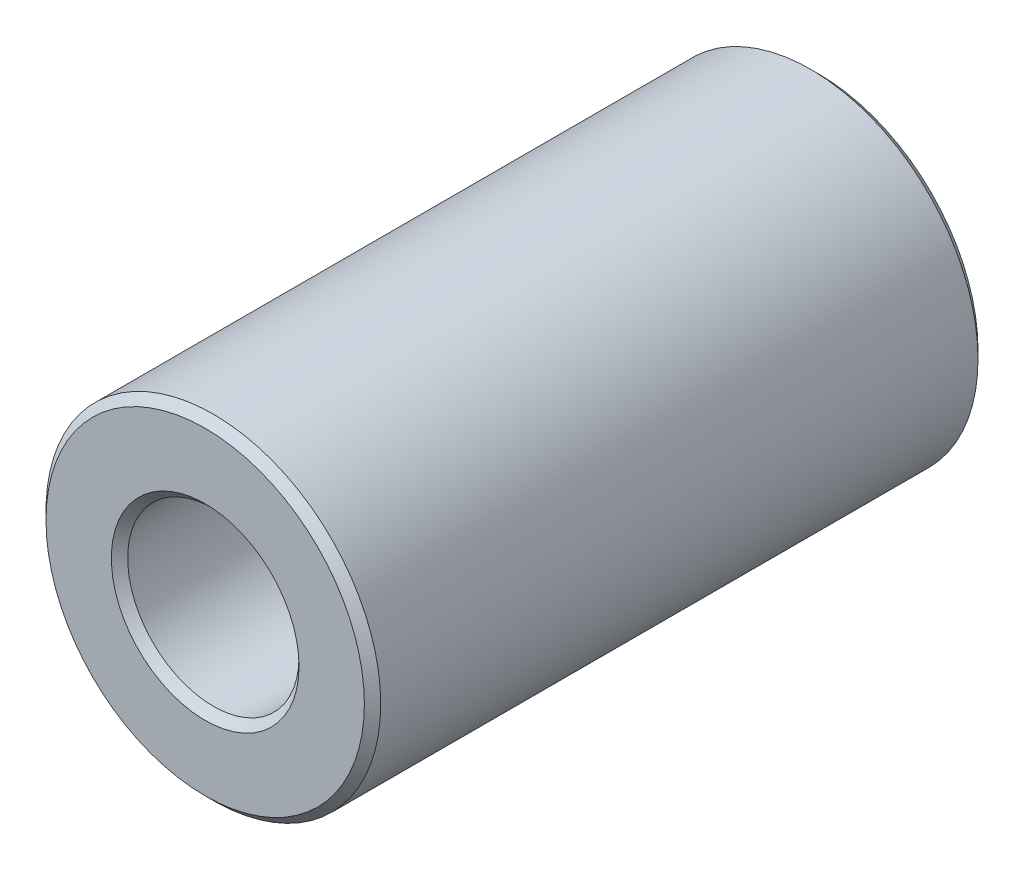
ISO-10303-21;
HEADER;
FILE_DESCRIPTION(('STEP AP214'),'2;1');
FILE_NAME('part.step','',(''),(''),'','','');
FILE_SCHEMA(('AUTOMOTIVE_DESIGN { 1 0 10303 214 1 1 1 1 }'));
ENDSEC;
DATA;
#1=APPLICATION_CONTEXT('core data for automotive mechanical design processes');
#2=APPLICATION_PROTOCOL_DEFINITION('international standard','automotive_design',2000,#1);
#3=PRODUCT_CONTEXT('',#1,'mechanical');
#4=PRODUCT('Part','Part','',(#3));
#5=PRODUCT_RELATED_PRODUCT_CATEGORY('part','',(#4));
#6=PRODUCT_DEFINITION_FORMATION('','',#4);
#7=PRODUCT_DEFINITION_CONTEXT('part definition',#1,'design');
#8=PRODUCT_DEFINITION('design','',#6,#7);
#9=PRODUCT_DEFINITION_SHAPE('','',#8);
#10=(LENGTH_UNIT() NAMED_UNIT(*) SI_UNIT(.MILLI.,.METRE.));
#11=(NAMED_UNIT(*) PLANE_ANGLE_UNIT() SI_UNIT($,.RADIAN.));
#12=(NAMED_UNIT(*) SI_UNIT($,.STERADIAN.) SOLID_ANGLE_UNIT());
#13=UNCERTAINTY_MEASURE_WITH_UNIT(LENGTH_MEASURE(1.E-05),#10,'distance_accuracy_value','');
#14=(GEOMETRIC_REPRESENTATION_CONTEXT(3) GLOBAL_UNCERTAINTY_ASSIGNED_CONTEXT((#13)) GLOBAL_UNIT_ASSIGNED_CONTEXT((#10,
#11,#12)) REPRESENTATION_CONTEXT('',''));
#15=CARTESIAN_POINT('',(0.,0.,0.));
#16=DIRECTION('',(0.,0.,1.));
#17=DIRECTION('',(1.,0.,0.));
#18=AXIS2_PLACEMENT_3D('',#15,#16,#17);
#19=CARTESIAN_POINT('',(0.,0.,-8.73125));
#20=DIRECTION('',(0.,0.,1.));
#21=DIRECTION('',(1.,0.,0.));
#22=AXIS2_PLACEMENT_3D('',#19,#20,#21);
#23=CYLINDRICAL_SURFACE('',#22,4.7625);
#24=CARTESIAN_POINT('',(0.,0.,8.49884));
#25=DIRECTION('',(0.,0.,1.));
#26=DIRECTION('',(1.,0.,0.));
#27=AXIS2_PLACEMENT_3D('',#24,#25,#26);
#28=CIRCLE('',#27,4.7625);
#29=CARTESIAN_POINT('',(4.7625,0.,8.49884));
#30=VERTEX_POINT('',#29);
#31=EDGE_CURVE('E55',#30,#30,#28,.F.);
#32=ORIENTED_EDGE('',*,*,#31,.T.);
#33=EDGE_LOOP('',(#32));
#34=FACE_BOUND('',#33,.T.);
#35=CARTESIAN_POINT('',(0.,0.,-8.49884));
#36=DIRECTION('',(0.,0.,1.));
#37=DIRECTION('',(1.,0.,0.));
#38=AXIS2_PLACEMENT_3D('',#35,#36,#37);
#39=CIRCLE('',#38,4.7625);
#40=CARTESIAN_POINT('',(4.7625,0.,-8.49884));
#41=VERTEX_POINT('',#40);
#42=EDGE_CURVE('E58',#41,#41,#39,.T.);
#43=ORIENTED_EDGE('',*,*,#42,.T.);
#44=EDGE_LOOP('',(#43));
#45=FACE_BOUND('',#44,.T.);
#46=ADVANCED_FACE('F35',(#34,#45),#23,.T.);
#47=CARTESIAN_POINT('',(0.,0.,-8.73125));
#48=DIRECTION('',(0.,0.,1.));
#49=DIRECTION('',(1.,0.,0.));
#50=AXIS2_PLACEMENT_3D('',#47,#48,#49);
#51=PLANE('',#50);
#52=CARTESIAN_POINT('',(0.,0.,-8.73125));
#53=DIRECTION('',(0.,0.,1.));
#54=DIRECTION('',(1.,0.,0.));
#55=AXIS2_PLACEMENT_3D('',#52,#53,#54);
#56=CIRCLE('',#55,4.53009);
#57=CARTESIAN_POINT('',(4.53009,0.,-8.73125));
#58=VERTEX_POINT('',#57);
#59=EDGE_CURVE('E46',#58,#58,#56,.F.);
#60=ORIENTED_EDGE('',*,*,#59,.T.);
#61=EDGE_LOOP('',(#60));
#62=FACE_BOUND('',#61,.T.);
#63=CARTESIAN_POINT('',(0.,0.,-8.73125));
#64=DIRECTION('',(0.,0.,1.));
#65=DIRECTION('',(1.,0.,0.));
#66=AXIS2_PLACEMENT_3D('',#63,#64,#65);
#67=CIRCLE('',#66,2.67081000000001);
#68=CARTESIAN_POINT('',(-2.67081000000001,0.,-8.73125));
#69=VERTEX_POINT('',#68);
#70=EDGE_CURVE('E50',#69,#69,#67,.T.);
#71=ORIENTED_EDGE('',*,*,#70,.T.);
#72=EDGE_LOOP('',(#71));
#73=FACE_BOUND('',#72,.T.);
#74=ADVANCED_FACE('F83',(#62,#73),#51,.F.);
#75=CARTESIAN_POINT('',(0.,0.,-8.73125));
#76=DIRECTION('',(0.,0.,1.));
#77=DIRECTION('',(1.,0.,0.));
#78=AXIS2_PLACEMENT_3D('',#75,#76,#77);
#79=CYLINDRICAL_SURFACE('',#78,2.4384);
#80=CARTESIAN_POINT('',(0.,0.,8.49884));
#81=DIRECTION('',(0.,0.,1.));
#82=DIRECTION('',(1.,0.,0.));
#83=AXIS2_PLACEMENT_3D('',#80,#81,#82);
#84=CIRCLE('',#83,2.4384);
#85=CARTESIAN_POINT('',(2.4384,0.,8.49884));
#86=VERTEX_POINT('',#85);
#87=EDGE_CURVE('E10',#86,#86,#84,.T.);
#88=ORIENTED_EDGE('',*,*,#87,.T.);
#89=EDGE_LOOP('',(#88));
#90=FACE_BOUND('',#89,.T.);
#91=CARTESIAN_POINT('',(0.,0.,-8.49884));
#92=DIRECTION('',(0.,0.,1.));
#93=DIRECTION('',(1.,0.,0.));
#94=AXIS2_PLACEMENT_3D('',#91,#92,#93);
#95=CIRCLE('',#94,2.4384);
#96=CARTESIAN_POINT('',(-2.4384,0.,-8.49884));
#97=VERTEX_POINT('',#96);
#98=EDGE_CURVE('E42',#97,#97,#95,.F.);
#99=ORIENTED_EDGE('',*,*,#98,.T.);
#100=EDGE_LOOP('',(#99));
#101=FACE_BOUND('',#100,.T.);
#102=ADVANCED_FACE('F89',(#90,#101),#79,.F.);
#103=CARTESIAN_POINT('',(0.,0.,8.73125));
#104=DIRECTION('',(0.,0.,1.));
#105=DIRECTION('',(1.,0.,0.));
#106=AXIS2_PLACEMENT_3D('',#103,#104,#105);
#107=PLANE('',#106);
#108=CARTESIAN_POINT('',(0.,0.,8.73125));
#109=DIRECTION('',(0.,0.,1.));
#110=DIRECTION('',(1.,0.,0.));
#111=AXIS2_PLACEMENT_3D('',#108,#109,#110);
#112=CIRCLE('',#111,4.53009);
#113=CARTESIAN_POINT('',(4.53009,0.,8.73125));
#114=VERTEX_POINT('',#113);
#115=EDGE_CURVE('E61',#114,#114,#112,.T.);
#116=ORIENTED_EDGE('',*,*,#115,.T.);
#117=EDGE_LOOP('',(#116));
#118=FACE_BOUND('',#117,.T.);
#119=CARTESIAN_POINT('',(0.,0.,8.73125));
#120=DIRECTION('',(0.,0.,1.));
#121=DIRECTION('',(1.,0.,0.));
#122=AXIS2_PLACEMENT_3D('',#119,#120,#121);
#123=CIRCLE('',#122,2.67081);
#124=CARTESIAN_POINT('',(2.67081,0.,8.73125));
#125=VERTEX_POINT('',#124);
#126=EDGE_CURVE('E64',#125,#125,#123,.F.);
#127=ORIENTED_EDGE('',*,*,#126,.T.);
#128=EDGE_LOOP('',(#127));
#129=FACE_BOUND('',#128,.T.);
#130=ADVANCED_FACE('F68',(#118,#129),#107,.T.);
#131=CARTESIAN_POINT('',(0.,0.,8.73125));
#132=DIRECTION('',(0.,0.,-1.));
#133=DIRECTION('',(-1.,0.,0.));
#134=AXIS2_PLACEMENT_3D('',#131,#132,#133);
#135=CONICAL_SURFACE('',#134,4.53009,0.78539816339745);
#136=ORIENTED_EDGE('',*,*,#31,.F.);
#137=EDGE_LOOP('',(#136));
#138=FACE_BOUND('',#137,.T.);
#139=ORIENTED_EDGE('',*,*,#115,.F.);
#140=EDGE_LOOP('',(#139));
#141=FACE_BOUND('',#140,.T.);
#142=ADVANCED_FACE('F79',(#138,#141),#135,.T.);
#143=CARTESIAN_POINT('',(0.,0.,-8.49884));
#144=DIRECTION('',(0.,0.,1.));
#145=DIRECTION('',(1.,0.,0.));
#146=AXIS2_PLACEMENT_3D('',#143,#144,#145);
#147=CONICAL_SURFACE('',#146,4.7625,0.785398163397446);
#148=ORIENTED_EDGE('',*,*,#59,.F.);
#149=EDGE_LOOP('',(#148));
#150=FACE_BOUND('',#149,.T.);
#151=ORIENTED_EDGE('',*,*,#42,.F.);
#152=EDGE_LOOP('',(#151));
#153=FACE_BOUND('',#152,.T.);
#154=ADVANCED_FACE('F73',(#150,#153),#147,.T.);
#155=CARTESIAN_POINT('',(0.,0.,8.49884));
#156=DIRECTION('',(0.,0.,1.));
#157=DIRECTION('',(1.,0.,0.));
#158=AXIS2_PLACEMENT_3D('',#155,#156,#157);
#159=CONICAL_SURFACE('',#158,2.4384,0.785398163397441);
#160=ORIENTED_EDGE('',*,*,#126,.F.);
#161=EDGE_LOOP('',(#160));
#162=FACE_BOUND('',#161,.T.);
#163=ORIENTED_EDGE('',*,*,#87,.F.);
#164=EDGE_LOOP('',(#163));
#165=FACE_BOUND('',#164,.T.);
#166=ADVANCED_FACE('F70',(#162,#165),#159,.F.);
#167=CARTESIAN_POINT('',(0.,0.,-8.73125));
#168=DIRECTION('',(0.,0.,-1.));
#169=DIRECTION('',(-1.,0.,0.));
#170=AXIS2_PLACEMENT_3D('',#167,#168,#169);
#171=CONICAL_SURFACE('',#170,2.67081000000001,0.785398163397452);
#172=CARTESIAN_POINT('',(-2.4384,0.,-8.49884));
#173=CARTESIAN_POINT('',(-2.4408209375,0.,-8.5012609375));
#174=CARTESIAN_POINT('',(-2.443241875,0.,-8.50368187499999));
#175=CARTESIAN_POINT('',(-2.44808375,0.,-8.50852375));
#176=CARTESIAN_POINT('',(-2.4505046875,0.,-8.51094468749999));
#177=CARTESIAN_POINT('',(-2.4553465625,0.,-8.5157865625));
#178=CARTESIAN_POINT('',(-2.4577675,0.,-8.5182075));
#179=CARTESIAN_POINT('',(-2.462609375,0.,-8.523049375));
#180=CARTESIAN_POINT('',(-2.4650303125,0.,-8.5254703125));
#181=CARTESIAN_POINT('',(-2.4698721875,0.,-8.5303121875));
#182=CARTESIAN_POINT('',(-2.472293125,0.,-8.532733125));
#183=CARTESIAN_POINT('',(-2.477135,0.,-8.537575));
#184=CARTESIAN_POINT('',(-2.4795559375,0.,-8.5399959375));
#185=CARTESIAN_POINT('',(-2.4843978125,0.,-8.5448378125));
#186=CARTESIAN_POINT('',(-2.48681875,0.,-8.54725875));
#187=CARTESIAN_POINT('',(-2.491660625,0.,-8.552100625));
#188=CARTESIAN_POINT('',(-2.4940815625,0.,-8.5545215625));
#189=CARTESIAN_POINT('',(-2.4989234375,0.,-8.5593634375));
#190=CARTESIAN_POINT('',(-2.501344375,0.,-8.561784375));
#191=CARTESIAN_POINT('',(-2.50618625,0.,-8.56662625));
#192=CARTESIAN_POINT('',(-2.5086071875,0.,-8.5690471875));
#193=CARTESIAN_POINT('',(-2.5134490625,0.,-8.5738890625));
#194=CARTESIAN_POINT('',(-2.51587,0.,-8.57631));
#195=CARTESIAN_POINT('',(-2.520711875,0.,-8.581151875));
#196=CARTESIAN_POINT('',(-2.5231328125,0.,-8.5835728125));
#197=CARTESIAN_POINT('',(-2.5279746875,0.,-8.5884146875));
#198=CARTESIAN_POINT('',(-2.530395625,0.,-8.590835625));
#199=CARTESIAN_POINT('',(-2.5352375,0.,-8.5956775));
#200=CARTESIAN_POINT('',(-2.5376584375,0.,-8.5980984375));
#201=CARTESIAN_POINT('',(-2.5425003125,0.,-8.6029403125));
#202=CARTESIAN_POINT('',(-2.54492125,0.,-8.60536125));
#203=CARTESIAN_POINT('',(-2.549763125,0.,-8.610203125));
#204=CARTESIAN_POINT('',(-2.5521840625,0.,-8.6126240625));
#205=CARTESIAN_POINT('',(-2.5570259375,0.,-8.6174659375));
#206=CARTESIAN_POINT('',(-2.559446875,0.,-8.619886875));
#207=CARTESIAN_POINT('',(-2.56428875,0.,-8.62472875));
#208=CARTESIAN_POINT('',(-2.5667096875,0.,-8.6271496875));
#209=CARTESIAN_POINT('',(-2.5715515625,0.,-8.6319915625));
#210=CARTESIAN_POINT('',(-2.5739725,0.,-8.6344125));
#211=CARTESIAN_POINT('',(-2.57881437500001,0.,-8.639254375));
#212=CARTESIAN_POINT('',(-2.5812353125,0.,-8.6416753125));
#213=CARTESIAN_POINT('',(-2.5860771875,0.,-8.6465171875));
#214=CARTESIAN_POINT('',(-2.588498125,0.,-8.648938125));
#215=CARTESIAN_POINT('',(-2.59334,0.,-8.65378));
#216=CARTESIAN_POINT('',(-2.5957609375,0.,-8.6562009375));
#217=CARTESIAN_POINT('',(-2.6006028125,0.,-8.6610428125));
#218=CARTESIAN_POINT('',(-2.60302375000001,0.,-8.66346375));
#219=CARTESIAN_POINT('',(-2.60786562500001,0.,-8.668305625));
#220=CARTESIAN_POINT('',(-2.61028656250001,0.,-8.6707265625));
#221=CARTESIAN_POINT('',(-2.61512843750001,0.,-8.6755684375));
#222=CARTESIAN_POINT('',(-2.61754937500001,0.,-8.677989375));
#223=CARTESIAN_POINT('',(-2.62239125000001,0.,-8.68283125));
#224=CARTESIAN_POINT('',(-2.62481218750001,0.,-8.6852521875));
#225=CARTESIAN_POINT('',(-2.62965406250001,0.,-8.6900940625));
#226=CARTESIAN_POINT('',(-2.63207500000001,0.,-8.692515));
#227=CARTESIAN_POINT('',(-2.63691687500001,0.,-8.697356875));
#228=CARTESIAN_POINT('',(-2.63933781250001,0.,-8.6997778125));
#229=CARTESIAN_POINT('',(-2.64417968750001,0.,-8.7046196875));
#230=CARTESIAN_POINT('',(-2.64660062500001,0.,-8.707040625));
#231=CARTESIAN_POINT('',(-2.65144250000001,0.,-8.7118825));
#232=CARTESIAN_POINT('',(-2.65386343750001,0.,-8.7143034375));
#233=CARTESIAN_POINT('',(-2.65870531250001,0.,-8.7191453125));
#234=CARTESIAN_POINT('',(-2.66112625000001,0.,-8.72156625));
#235=CARTESIAN_POINT('',(-2.66596812500001,0.,-8.726408125));
#236=CARTESIAN_POINT('',(-2.66838906250001,0.,-8.7288290625));
#237=CARTESIAN_POINT('',(-2.67081000000001,0.,-8.73125));
#238=B_SPLINE_CURVE_WITH_KNOTS('',3,(#172,#173,#174,#175,#176,#177,#178,#179,#180,#181,#182,
#183,#184,#185,#186,#187,#188,#189,#190,#191,#192,#193,#194,#195,#196,#197,#198,#199,#200,#201,
#202,#203,#204,#205,#206,#207,#208,#209,#210,#211,#212,#213,#214,#215,#216,#217,#218,#219,#220,
#221,#222,#223,#224,#225,#226,#227,#228,#229,#230,#231,#232,#233,#234,#235,#236,#237),
.UNSPECIFIED.,.F.,.F.,(4,2,2,2,2,2,2,2,2,2,2,2,2,2,2,2,2,2,2,2,2,2,2,2,2,2,2,2,2,2,2,2,4),(0.,
0.0102711679384733,0.0205423358769465,0.0308135038154201,0.0410846717538933,0.0513558396923654,
0.0616270076308386,0.0718981755693122,0.0821693435077854,0.0924405114462587,0.102711679384731,
0.112982847323204,0.123254015261678,0.133525183200151,0.143796351138623,0.154067519077096,
0.16433868701557,0.174609854954043,0.184881022892516,0.195152190830988,0.205423358769462,
0.215694526707935,0.225965694646408,0.236236862584881,0.246508030523354,0.256779198461827,
0.267050366400301,0.277321534338774,0.287592702277246,0.297863870215719,0.308135038154193,
0.318406206092666,0.328677374031138),.UNSPECIFIED.);
#239=EDGE_CURVE('BSEAM37',#97,#69,#238,.T.);
#240=ORIENTED_EDGE('',*,*,#98,.F.);
#241=ORIENTED_EDGE('',*,*,#70,.F.);
#242=ORIENTED_EDGE('',*,*,#239,.T.);
#243=ORIENTED_EDGE('',*,*,#239,.F.);
#244=EDGE_LOOP('',(#240,#242,#241,#243));
#245=FACE_BOUND('',#244,.T.);
#246=ADVANCED_FACE('F37',(#245),#171,.F.);
#247=CLOSED_SHELL('',(#46,#74,#102,#130,#142,#154,#166,#246));
#248=MANIFOLD_SOLID_BREP('B2',#247);
#249=ADVANCED_BREP_SHAPE_REPRESENTATION('',(#18,#248),#14);
#250=SHAPE_DEFINITION_REPRESENTATION(#9,#249);
ENDSEC;
END-ISO-10303-21;
